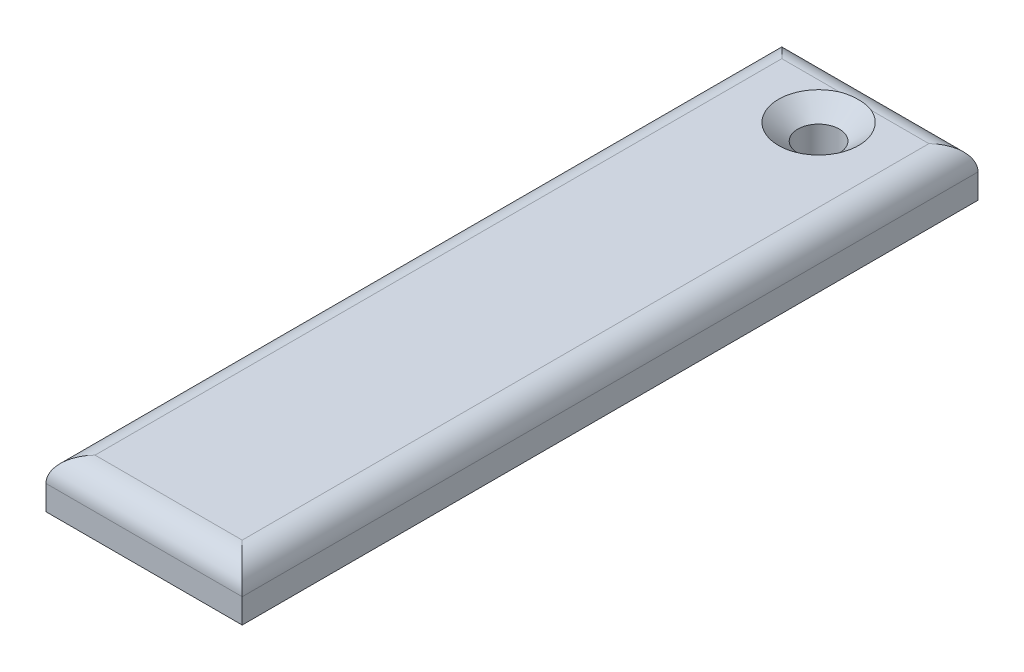
ISO-10303-21;
HEADER;
FILE_DESCRIPTION(('STEP AP214'),'2;1');
FILE_NAME('part.step','',(''),(''),'','','');
FILE_SCHEMA(('AUTOMOTIVE_DESIGN { 1 0 10303 214 1 1 1 1 }'));
ENDSEC;
DATA;
#1=APPLICATION_CONTEXT('core data for automotive mechanical design processes');
#2=APPLICATION_PROTOCOL_DEFINITION('international standard','automotive_design',2000,#1);
#3=PRODUCT_CONTEXT('',#1,'mechanical');
#4=PRODUCT('Part','Part','',(#3));
#5=PRODUCT_RELATED_PRODUCT_CATEGORY('part','',(#4));
#6=PRODUCT_DEFINITION_FORMATION('','',#4);
#7=PRODUCT_DEFINITION_CONTEXT('part definition',#1,'design');
#8=PRODUCT_DEFINITION('design','',#6,#7);
#9=PRODUCT_DEFINITION_SHAPE('','',#8);
#10=(LENGTH_UNIT() NAMED_UNIT(*) SI_UNIT(.MILLI.,.METRE.));
#11=(NAMED_UNIT(*) PLANE_ANGLE_UNIT() SI_UNIT($,.RADIAN.));
#12=(NAMED_UNIT(*) SI_UNIT($,.STERADIAN.) SOLID_ANGLE_UNIT());
#13=UNCERTAINTY_MEASURE_WITH_UNIT(LENGTH_MEASURE(1.E-05),#10,'distance_accuracy_value','');
#14=(GEOMETRIC_REPRESENTATION_CONTEXT(3) GLOBAL_UNCERTAINTY_ASSIGNED_CONTEXT((#13)) GLOBAL_UNIT_ASSIGNED_CONTEXT((#10,
#11,#12)) REPRESENTATION_CONTEXT('',''));
#15=CARTESIAN_POINT('',(0.,0.,0.));
#16=DIRECTION('',(0.,0.,1.));
#17=DIRECTION('',(1.,0.,0.));
#18=AXIS2_PLACEMENT_3D('',#15,#16,#17);
#19=CARTESIAN_POINT('',(10.16,5.08,38.1));
#20=DIRECTION('',(-1.,0.,0.));
#21=DIRECTION('',(0.,0.,1.));
#22=AXIS2_PLACEMENT_3D('',#19,#20,#21);
#23=PLANE('',#22);
#24=DIRECTION('',(0.,-1.,0.));
#25=VECTOR('',#24,1.);
#26=CARTESIAN_POINT('',(10.16,5.08,-38.1));
#27=LINE('',#26,#25);
#28=CARTESIAN_POINT('',(10.16,2.54,-38.1));
#29=VERTEX_POINT('',#28);
#30=CARTESIAN_POINT('',(10.16,0.,-38.1));
#31=VERTEX_POINT('',#30);
#32=EDGE_CURVE('E93',#29,#31,#27,.T.);
#33=ORIENTED_EDGE('',*,*,#32,.F.);
#34=DIRECTION('',(0.,0.,-1.));
#35=VECTOR('',#34,1.);
#36=CARTESIAN_POINT('',(10.16,2.54,38.1));
#37=LINE('',#36,#35);
#38=CARTESIAN_POINT('',(10.16,2.54,38.1));
#39=VERTEX_POINT('',#38);
#40=EDGE_CURVE('E56',#29,#39,#37,.F.);
#41=ORIENTED_EDGE('',*,*,#40,.T.);
#42=DIRECTION('',(0.,-1.,0.));
#43=VECTOR('',#42,1.);
#44=CARTESIAN_POINT('',(10.16,5.08,38.1));
#45=LINE('',#44,#43);
#46=CARTESIAN_POINT('',(10.16,0.,38.1));
#47=VERTEX_POINT('',#46);
#48=EDGE_CURVE('E113',#39,#47,#45,.T.);
#49=ORIENTED_EDGE('',*,*,#48,.T.);
#50=DIRECTION('',(0.,0.,-1.));
#51=VECTOR('',#50,1.);
#52=CARTESIAN_POINT('',(10.16,0.,38.1));
#53=LINE('',#52,#51);
#54=EDGE_CURVE('E109',#47,#31,#53,.T.);
#55=ORIENTED_EDGE('',*,*,#54,.T.);
#56=EDGE_LOOP('',(#33,#41,#49,#55));
#57=FACE_BOUND('',#56,.T.);
#58=ADVANCED_FACE('F33',(#57),#23,.F.);
#59=CARTESIAN_POINT('',(-10.16,5.08,-38.1));
#60=DIRECTION('',(0.,0.,1.));
#61=DIRECTION('',(1.,0.,0.));
#62=AXIS2_PLACEMENT_3D('',#59,#60,#61);
#63=PLANE('',#62);
#64=DIRECTION('',(0.,-1.,0.));
#65=VECTOR('',#64,1.);
#66=CARTESIAN_POINT('',(-10.16,5.08,-38.1));
#67=LINE('',#66,#65);
#68=CARTESIAN_POINT('',(-10.16,2.54,-38.1));
#69=VERTEX_POINT('',#68);
#70=CARTESIAN_POINT('',(-10.16,0.,-38.1));
#71=VERTEX_POINT('',#70);
#72=EDGE_CURVE('E103',#69,#71,#67,.T.);
#73=ORIENTED_EDGE('',*,*,#72,.F.);
#74=DIRECTION('',(-1.,0.,0.));
#75=VECTOR('',#74,1.);
#76=CARTESIAN_POINT('',(-10.16,2.54,-38.1));
#77=LINE('',#76,#75);
#78=EDGE_CURVE('E100',#69,#29,#77,.F.);
#79=ORIENTED_EDGE('',*,*,#78,.T.);
#80=ORIENTED_EDGE('',*,*,#32,.T.);
#81=DIRECTION('',(-1.,0.,0.));
#82=VECTOR('',#81,1.);
#83=CARTESIAN_POINT('',(-10.16,0.,-38.1));
#84=LINE('',#83,#82);
#85=EDGE_CURVE('E97',#31,#71,#84,.T.);
#86=ORIENTED_EDGE('',*,*,#85,.T.);
#87=EDGE_LOOP('',(#73,#79,#80,#86));
#88=FACE_BOUND('',#87,.T.);
#89=ADVANCED_FACE('F96',(#88),#63,.F.);
#90=CARTESIAN_POINT('',(-10.16,5.08,38.1));
#91=DIRECTION('',(1.,0.,0.));
#92=DIRECTION('',(0.,0.,-1.));
#93=AXIS2_PLACEMENT_3D('',#90,#91,#92);
#94=PLANE('',#93);
#95=DIRECTION('',(0.,-1.,0.));
#96=VECTOR('',#95,1.);
#97=CARTESIAN_POINT('',(-10.16,5.08,38.1));
#98=LINE('',#97,#96);
#99=CARTESIAN_POINT('',(-10.16,2.54,38.1));
#100=VERTEX_POINT('',#99);
#101=CARTESIAN_POINT('',(-10.16,0.,38.1));
#102=VERTEX_POINT('',#101);
#103=EDGE_CURVE('E126',#100,#102,#98,.T.);
#104=ORIENTED_EDGE('',*,*,#103,.F.);
#105=DIRECTION('',(0.,0.,1.));
#106=VECTOR('',#105,1.);
#107=CARTESIAN_POINT('',(-10.16,2.54,38.1));
#108=LINE('',#107,#106);
#109=EDGE_CURVE('E42',#100,#69,#108,.F.);
#110=ORIENTED_EDGE('',*,*,#109,.T.);
#111=ORIENTED_EDGE('',*,*,#72,.T.);
#112=DIRECTION('',(0.,0.,1.));
#113=VECTOR('',#112,1.);
#114=CARTESIAN_POINT('',(-10.16,0.,38.1));
#115=LINE('',#114,#113);
#116=EDGE_CURVE('E111',#71,#102,#115,.T.);
#117=ORIENTED_EDGE('',*,*,#116,.T.);
#118=EDGE_LOOP('',(#104,#110,#111,#117));
#119=FACE_BOUND('',#118,.T.);
#120=ADVANCED_FACE('F171',(#119),#94,.F.);
#121=CARTESIAN_POINT('',(-10.16,5.08,38.1));
#122=DIRECTION('',(0.,0.,-1.));
#123=DIRECTION('',(-1.,0.,0.));
#124=AXIS2_PLACEMENT_3D('',#121,#122,#123);
#125=PLANE('',#124);
#126=ORIENTED_EDGE('',*,*,#48,.F.);
#127=DIRECTION('',(1.,0.,0.));
#128=VECTOR('',#127,1.);
#129=CARTESIAN_POINT('',(-10.16,2.54,38.1));
#130=LINE('',#129,#128);
#131=EDGE_CURVE('E11',#39,#100,#130,.F.);
#132=ORIENTED_EDGE('',*,*,#131,.T.);
#133=ORIENTED_EDGE('',*,*,#103,.T.);
#134=DIRECTION('',(1.,0.,0.));
#135=VECTOR('',#134,1.);
#136=CARTESIAN_POINT('',(-10.16,0.,38.1));
#137=LINE('',#136,#135);
#138=EDGE_CURVE('E123',#102,#47,#137,.T.);
#139=ORIENTED_EDGE('',*,*,#138,.T.);
#140=EDGE_LOOP('',(#126,#132,#133,#139));
#141=FACE_BOUND('',#140,.T.);
#142=ADVANCED_FACE('F164',(#141),#125,.F.);
#143=CARTESIAN_POINT('',(0.,5.08,0.));
#144=DIRECTION('',(0.,-1.,0.));
#145=DIRECTION('',(0.,0.,-1.));
#146=AXIS2_PLACEMENT_3D('',#143,#144,#145);
#147=PLANE('',#146);
#148=DIRECTION('',(0.,0.,-1.));
#149=VECTOR('',#148,1.);
#150=CARTESIAN_POINT('',(7.62,5.08,0.));
#151=LINE('',#150,#149);
#152=CARTESIAN_POINT('',(7.62,5.08,35.56));
#153=VERTEX_POINT('',#152);
#154=CARTESIAN_POINT('',(7.62,5.08,-35.56));
#155=VERTEX_POINT('',#154);
#156=EDGE_CURVE('E132',#153,#155,#151,.T.);
#157=ORIENTED_EDGE('',*,*,#156,.T.);
#158=DIRECTION('',(-1.,0.,0.));
#159=VECTOR('',#158,1.);
#160=CARTESIAN_POINT('',(0.,5.08,-35.56));
#161=LINE('',#160,#159);
#162=CARTESIAN_POINT('',(1.64185455101266,5.08,-35.56));
#163=VERTEX_POINT('',#162);
#164=EDGE_CURVE('E136',#155,#163,#161,.T.);
#165=ORIENTED_EDGE('',*,*,#164,.T.);
#166=CARTESIAN_POINT('',(0.,5.08,-31.75));
#167=DIRECTION('',(0.,1.,0.));
#168=DIRECTION('',(0.,0.,1.));
#169=AXIS2_PLACEMENT_3D('',#166,#167,#168);
#170=CIRCLE('',#169,4.148709);
#171=CARTESIAN_POINT('',(-1.64185455101266,5.08,-35.56));
#172=VERTEX_POINT('',#171);
#173=EDGE_CURVE('E276',#172,#163,#170,.T.);
#174=ORIENTED_EDGE('',*,*,#173,.F.);
#175=DIRECTION('',(-1.,0.,0.));
#176=VECTOR('',#175,1.);
#177=CARTESIAN_POINT('',(0.,5.08,-35.56));
#178=LINE('',#177,#176);
#179=CARTESIAN_POINT('',(-7.62,5.08,-35.56));
#180=VERTEX_POINT('',#179);
#181=EDGE_CURVE('E134',#172,#180,#178,.T.);
#182=ORIENTED_EDGE('',*,*,#181,.T.);
#183=DIRECTION('',(0.,0.,1.));
#184=VECTOR('',#183,1.);
#185=CARTESIAN_POINT('',(-7.62,5.08,0.));
#186=LINE('',#185,#184);
#187=CARTESIAN_POINT('',(-7.62,5.08,35.56));
#188=VERTEX_POINT('',#187);
#189=EDGE_CURVE('E130',#180,#188,#186,.T.);
#190=ORIENTED_EDGE('',*,*,#189,.T.);
#191=DIRECTION('',(1.,0.,0.));
#192=VECTOR('',#191,1.);
#193=CARTESIAN_POINT('',(0.,5.08,35.56));
#194=LINE('',#193,#192);
#195=EDGE_CURVE('E102',#188,#153,#194,.T.);
#196=ORIENTED_EDGE('',*,*,#195,.T.);
#197=EDGE_LOOP('',(#157,#165,#174,#182,#190,#196));
#198=FACE_BOUND('',#197,.T.);
#199=ADVANCED_FACE('F161',(#198),#147,.F.);
#200=CARTESIAN_POINT('',(0.,0.,0.));
#201=DIRECTION('',(0.,-1.,0.));
#202=DIRECTION('',(0.,0.,-1.));
#203=AXIS2_PLACEMENT_3D('',#200,#201,#202);
#204=PLANE('',#203);
#205=CARTESIAN_POINT('',(0.,0.,-31.75));
#206=DIRECTION('',(0.,1.,0.));
#207=DIRECTION('',(0.,0.,1.));
#208=AXIS2_PLACEMENT_3D('',#205,#206,#207);
#209=CIRCLE('',#208,2.15265);
#210=CARTESIAN_POINT('',(0.,0.,-29.59735));
#211=VERTEX_POINT('',#210);
#212=EDGE_CURVE('E115',#211,#211,#209,.T.);
#213=ORIENTED_EDGE('',*,*,#212,.T.);
#214=EDGE_LOOP('',(#213));
#215=FACE_BOUND('',#214,.T.);
#216=ORIENTED_EDGE('',*,*,#54,.F.);
#217=ORIENTED_EDGE('',*,*,#138,.F.);
#218=ORIENTED_EDGE('',*,*,#116,.F.);
#219=ORIENTED_EDGE('',*,*,#85,.F.);
#220=EDGE_LOOP('',(#216,#217,#218,#219));
#221=FACE_BOUND('',#220,.T.);
#222=ADVANCED_FACE('F107',(#215,#221),#204,.T.);
#223=CARTESIAN_POINT('',(0.,5.08,-31.75));
#224=DIRECTION('',(0.,1.,0.));
#225=DIRECTION('',(0.,0.,1.));
#226=AXIS2_PLACEMENT_3D('',#223,#224,#225);
#227=CYLINDRICAL_SURFACE('',#226,2.15265);
#228=ORIENTED_EDGE('',*,*,#212,.F.);
#229=EDGE_LOOP('',(#228));
#230=FACE_BOUND('',#229,.T.);
#231=CARTESIAN_POINT('',(0.,3.40510762929191,-31.75));
#232=DIRECTION('',(0.,1.,0.));
#233=DIRECTION('',(0.,0.,1.));
#234=AXIS2_PLACEMENT_3D('',#231,#232,#233);
#235=CIRCLE('',#234,2.15265);
#236=CARTESIAN_POINT('',(0.,3.40510762929191,-29.59735));
#237=VERTEX_POINT('',#236);
#238=EDGE_CURVE('E118',#237,#237,#235,.T.);
#239=ORIENTED_EDGE('',*,*,#238,.T.);
#240=EDGE_LOOP('',(#239));
#241=FACE_BOUND('',#240,.T.);
#242=ADVANCED_FACE('F156',(#230,#241),#227,.F.);
#243=CARTESIAN_POINT('',(0.,5.08,-31.75));
#244=DIRECTION('',(0.,1.,0.));
#245=DIRECTION('',(0.,0.,1.));
#246=AXIS2_PLACEMENT_3D('',#243,#244,#245);
#247=CONICAL_SURFACE('',#246,4.148709,0.872664625997165);
#248=ORIENTED_EDGE('',*,*,#238,.F.);
#249=EDGE_LOOP('',(#248));
#250=FACE_BOUND('',#249,.T.);
#251=ORIENTED_EDGE('',*,*,#173,.T.);
#252=CARTESIAN_POINT('',(1.64185455101266,5.08,-35.56));
#253=CARTESIAN_POINT('',(1.59612227938471,5.07999652857939,-35.5797031312357));
#254=CARTESIAN_POINT('',(1.5499419453312,5.0797710747715,-35.5983348251832));
#255=CARTESIAN_POINT('',(1.45682589431713,5.07899655510353,-35.6335551283386));
#256=CARTESIAN_POINT('',(1.40989040795203,5.07844758627472,-35.6501443483394));
#257=CARTESIAN_POINT('',(1.26824995310781,5.07649735203584,-35.6969718414011));
#258=CARTESIAN_POINT('',(1.17258517936183,5.07479209076483,-35.7243232672688));
#259=CARTESIAN_POINT('',(0.979394361171248,5.07125335625144,-35.7719525880578));
#260=CARTESIAN_POINT('',(0.881865788549258,5.06941969831347,-35.7922200310756));
#261=CARTESIAN_POINT('',(0.685614058027335,5.06608355508367,-35.826063877944));
#262=CARTESIAN_POINT('',(0.586890417560638,5.06458120862331,-35.8396374797676));
#263=CARTESIAN_POINT('',(0.378429746686224,5.06207675112475,-35.8614347138297));
#264=CARTESIAN_POINT('',(0.268618099136301,5.06114316769246,-35.8689525855014));
#265=CARTESIAN_POINT('',(0.0487324591676921,5.06022846932086,-35.8763249685584));
#266=CARTESIAN_POINT('',(-0.0613415446389818,5.06024739650841,-35.8761791409999));
#267=CARTESIAN_POINT('',(-0.281098568069281,5.06123263959713,-35.8682238104533));
#268=CARTESIAN_POINT('',(-0.390781867638842,5.06219801341887,-35.8604219281851));
#269=CARTESIAN_POINT('',(-0.60929816750711,5.06488073569896,-35.8369826969631));
#270=CARTESIAN_POINT('',(-0.71813130155302,5.06659796334855,-35.8213466067608));
#271=CARTESIAN_POINT('',(-0.896099188604284,5.0697028187712,-35.7888326206521));
#272=CARTESIAN_POINT('',(-0.965678424392606,5.07099263604601,-35.7743439450545));
#273=CARTESIAN_POINT('',(-1.10397169859414,5.07354002532321,-35.7417733666207));
#274=CARTESIAN_POINT('',(-1.17268603345271,5.07479760853596,-35.7236927326783));
#275=CARTESIAN_POINT('',(-1.30899100267637,5.07706396024893,-35.6837446041777));
#276=CARTESIAN_POINT('',(-1.37658203961059,5.0780728197622,-35.6618784998006));
#277=CARTESIAN_POINT('',(-1.51036837301954,5.07953302353271,-35.614066574788));
#278=CARTESIAN_POINT('',(-1.57656250467907,5.07998391928655,-35.5881174910235));
#279=CARTESIAN_POINT('',(-1.6418545510127,5.08000000000015,-35.5600000000002));
#280=B_SPLINE_CURVE_WITH_KNOTS('',3,(#252,#253,#254,#255,#256,#257,#258,#259,#260,#261,#262,
#263,#264,#265,#266,#267,#268,#269,#270,#271,#272,#273,#274,#275,#276,#277,#278,#279),
.UNSPECIFIED.,.F.,.F.,(4,2,2,2,2,2,2,2,2,2,2,2,2,4),(0.,0.149353822315945,0.29866287198487,
0.596872373227344,0.895520021902213,1.19429257792835,1.52423070662448,1.85418342756615,
2.18380805140197,2.51337973019078,2.72654646326901,2.93963802661921,3.15265149930475,
3.36583608585766),.UNSPECIFIED.);
#281=EDGE_CURVE('E139',#163,#172,#280,.T.);
#282=ORIENTED_EDGE('',*,*,#281,.T.);
#283=EDGE_LOOP('',(#251,#282));
#284=FACE_BOUND('',#283,.T.);
#285=ADVANCED_FACE('F152',(#250,#284),#247,.F.);
#286=CARTESIAN_POINT('',(0.,2.54,35.56));
#287=DIRECTION('',(1.,0.,0.));
#288=DIRECTION('',(0.,0.,-1.));
#289=AXIS2_PLACEMENT_3D('',#286,#287,#288);
#290=CYLINDRICAL_SURFACE('',#289,2.54);
#291=CARTESIAN_POINT('',(-7.62,2.54,35.56));
#292=DIRECTION('',(0.707106781186547,0.,0.707106781186547));
#293=DIRECTION('',(0.707106781186547,0.,-0.707106781186547));
#294=AXIS2_PLACEMENT_3D('',#291,#292,#293);
#295=ELLIPSE('',#294,3.59210244842766,2.54);
#296=EDGE_CURVE('E265',#100,#188,#295,.F.);
#297=ORIENTED_EDGE('',*,*,#296,.F.);
#298=ORIENTED_EDGE('',*,*,#131,.F.);
#299=CARTESIAN_POINT('',(7.62,2.54,35.56));
#300=DIRECTION('',(0.707106781186547,0.,-0.707106781186547));
#301=DIRECTION('',(0.707106781186547,0.,0.707106781186547));
#302=AXIS2_PLACEMENT_3D('',#299,#300,#301);
#303=ELLIPSE('',#302,3.59210244842766,2.54);
#304=EDGE_CURVE('E37',#153,#39,#303,.T.);
#305=ORIENTED_EDGE('',*,*,#304,.F.);
#306=ORIENTED_EDGE('',*,*,#195,.F.);
#307=EDGE_LOOP('',(#297,#298,#305,#306));
#308=FACE_BOUND('',#307,.T.);
#309=ADVANCED_FACE('F35',(#308),#290,.T.);
#310=CARTESIAN_POINT('',(7.62,2.54,0.));
#311=DIRECTION('',(0.,0.,-1.));
#312=DIRECTION('',(-1.,0.,0.));
#313=AXIS2_PLACEMENT_3D('',#310,#311,#312);
#314=CYLINDRICAL_SURFACE('',#313,2.54);
#315=ORIENTED_EDGE('',*,*,#304,.T.);
#316=ORIENTED_EDGE('',*,*,#40,.F.);
#317=CARTESIAN_POINT('',(7.62,2.54,-35.56));
#318=DIRECTION('',(-0.707106781186547,0.,-0.707106781186547));
#319=DIRECTION('',(0.707106781186547,0.,-0.707106781186547));
#320=AXIS2_PLACEMENT_3D('',#317,#318,#319);
#321=ELLIPSE('',#320,3.59210244842766,2.54);
#322=EDGE_CURVE('E261',#155,#29,#321,.T.);
#323=ORIENTED_EDGE('',*,*,#322,.F.);
#324=ORIENTED_EDGE('',*,*,#156,.F.);
#325=EDGE_LOOP('',(#315,#316,#323,#324));
#326=FACE_BOUND('',#325,.T.);
#327=ADVANCED_FACE('F213',(#326),#314,.T.);
#328=CARTESIAN_POINT('',(-7.62,2.54,0.));
#329=DIRECTION('',(0.,0.,1.));
#330=DIRECTION('',(1.,0.,0.));
#331=AXIS2_PLACEMENT_3D('',#328,#329,#330);
#332=CYLINDRICAL_SURFACE('',#331,2.54);
#333=ORIENTED_EDGE('',*,*,#296,.T.);
#334=ORIENTED_EDGE('',*,*,#189,.F.);
#335=CARTESIAN_POINT('',(-7.62,2.54,-35.56));
#336=DIRECTION('',(-0.707106781186547,0.,0.707106781186547));
#337=DIRECTION('',(0.707106781186547,0.,0.707106781186547));
#338=AXIS2_PLACEMENT_3D('',#335,#336,#337);
#339=ELLIPSE('',#338,3.59210244842766,2.54);
#340=EDGE_CURVE('E266',#69,#180,#339,.F.);
#341=ORIENTED_EDGE('',*,*,#340,.F.);
#342=ORIENTED_EDGE('',*,*,#109,.F.);
#343=EDGE_LOOP('',(#333,#334,#341,#342));
#344=FACE_BOUND('',#343,.T.);
#345=ADVANCED_FACE('F220',(#344),#332,.T.);
#346=CARTESIAN_POINT('',(0.,2.54,-35.56));
#347=DIRECTION('',(-1.,0.,0.));
#348=DIRECTION('',(0.,0.,1.));
#349=AXIS2_PLACEMENT_3D('',#346,#347,#348);
#350=CYLINDRICAL_SURFACE('',#349,2.54);
#351=ORIENTED_EDGE('',*,*,#322,.T.);
#352=ORIENTED_EDGE('',*,*,#78,.F.);
#353=ORIENTED_EDGE('',*,*,#340,.T.);
#354=ORIENTED_EDGE('',*,*,#181,.F.);
#355=ORIENTED_EDGE('',*,*,#281,.F.);
#356=ORIENTED_EDGE('',*,*,#164,.F.);
#357=EDGE_LOOP('',(#351,#352,#353,#354,#355,#356));
#358=FACE_BOUND('',#357,.T.);
#359=ADVANCED_FACE('F148',(#358),#350,.T.);
#360=CLOSED_SHELL('',(#58,#89,#120,#142,#199,#222,#242,#285,#309,#327,#345,#359));
#361=MANIFOLD_SOLID_BREP('B2',#360);
#362=ADVANCED_BREP_SHAPE_REPRESENTATION('',(#18,#361),#14);
#363=SHAPE_DEFINITION_REPRESENTATION(#9,#362);
ENDSEC;
END-ISO-10303-21;
